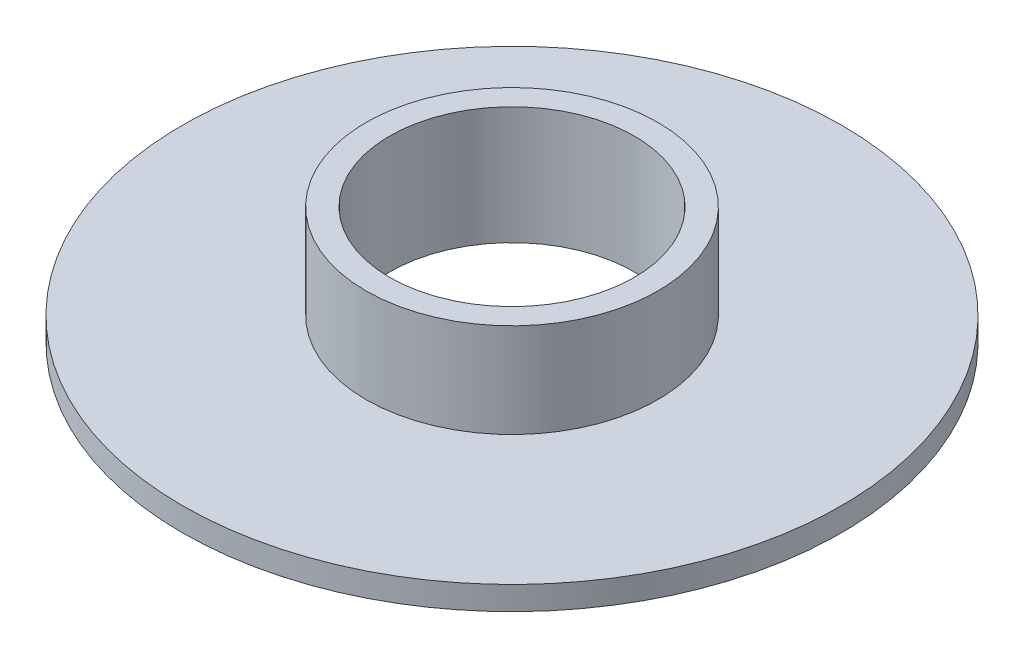
ISO-10303-21;
HEADER;
FILE_DESCRIPTION(('STEP AP214'),'2;1');
FILE_NAME('part.step','',(''),(''),'','','');
FILE_SCHEMA(('AUTOMOTIVE_DESIGN { 1 0 10303 214 1 1 1 1 }'));
ENDSEC;
DATA;
#1=APPLICATION_CONTEXT('core data for automotive mechanical design processes');
#2=APPLICATION_PROTOCOL_DEFINITION('international standard','automotive_design',2000,#1);
#3=PRODUCT_CONTEXT('',#1,'mechanical');
#4=PRODUCT('Part','Part','',(#3));
#5=PRODUCT_RELATED_PRODUCT_CATEGORY('part','',(#4));
#6=PRODUCT_DEFINITION_FORMATION('','',#4);
#7=PRODUCT_DEFINITION_CONTEXT('part definition',#1,'design');
#8=PRODUCT_DEFINITION('design','',#6,#7);
#9=PRODUCT_DEFINITION_SHAPE('','',#8);
#10=(LENGTH_UNIT() NAMED_UNIT(*) SI_UNIT(.MILLI.,.METRE.));
#11=(NAMED_UNIT(*) PLANE_ANGLE_UNIT() SI_UNIT($,.RADIAN.));
#12=(NAMED_UNIT(*) SI_UNIT($,.STERADIAN.) SOLID_ANGLE_UNIT());
#13=UNCERTAINTY_MEASURE_WITH_UNIT(LENGTH_MEASURE(1.E-05),#10,'distance_accuracy_value','');
#14=(GEOMETRIC_REPRESENTATION_CONTEXT(3) GLOBAL_UNCERTAINTY_ASSIGNED_CONTEXT((#13)) GLOBAL_UNIT_ASSIGNED_CONTEXT((#10,
#11,#12)) REPRESENTATION_CONTEXT('',''));
#15=CARTESIAN_POINT('',(0.,0.,0.));
#16=DIRECTION('',(0.,0.,1.));
#17=DIRECTION('',(1.,0.,0.));
#18=AXIS2_PLACEMENT_3D('',#15,#16,#17);
#19=CARTESIAN_POINT('',(0.,0.,0.));
#20=DIRECTION('',(0.,1.,0.));
#21=DIRECTION('',(0.,0.,1.));
#22=AXIS2_PLACEMENT_3D('',#19,#20,#21);
#23=PLANE('',#22);
#24=CARTESIAN_POINT('',(0.,0.,0.));
#25=DIRECTION('',(0.,1.,0.));
#26=DIRECTION('',(0.,0.,1.));
#27=AXIS2_PLACEMENT_3D('',#24,#25,#26);
#28=CIRCLE('',#27,26.);
#29=CARTESIAN_POINT('',(0.,0.,26.));
#30=VERTEX_POINT('',#29);
#31=EDGE_CURVE('E34',#30,#30,#28,.T.);
#32=ORIENTED_EDGE('',*,*,#31,.T.);
#33=EDGE_LOOP('',(#32));
#34=FACE_BOUND('',#33,.T.);
#35=CARTESIAN_POINT('',(0.,0.,0.));
#36=DIRECTION('',(0.,1.,0.));
#37=DIRECTION('',(0.,0.,1.));
#38=AXIS2_PLACEMENT_3D('',#35,#36,#37);
#39=CIRCLE('',#38,70.);
#40=CARTESIAN_POINT('',(0.,0.,70.));
#41=VERTEX_POINT('',#40);
#42=EDGE_CURVE('E10',#41,#41,#39,.T.);
#43=ORIENTED_EDGE('',*,*,#42,.F.);
#44=EDGE_LOOP('',(#43));
#45=FACE_BOUND('',#44,.T.);
#46=ADVANCED_FACE('F31',(#34,#45),#23,.F.);
#47=CARTESIAN_POINT('',(0.,4.99999999999999,0.));
#48=DIRECTION('',(0.,1.,0.));
#49=DIRECTION('',(0.,0.,1.));
#50=AXIS2_PLACEMENT_3D('',#47,#48,#49);
#51=CYLINDRICAL_SURFACE('',#50,70.);
#52=CARTESIAN_POINT('',(0.,5.,0.));
#53=DIRECTION('',(0.,1.,0.));
#54=DIRECTION('',(0.,0.,1.));
#55=AXIS2_PLACEMENT_3D('',#52,#53,#54);
#56=CIRCLE('',#55,70.);
#57=CARTESIAN_POINT('',(0.,5.,70.));
#58=VERTEX_POINT('',#57);
#59=EDGE_CURVE('E38',#58,#58,#56,.T.);
#60=ORIENTED_EDGE('',*,*,#59,.F.);
#61=EDGE_LOOP('',(#60));
#62=FACE_BOUND('',#61,.T.);
#63=ORIENTED_EDGE('',*,*,#42,.T.);
#64=EDGE_LOOP('',(#63));
#65=FACE_BOUND('',#64,.T.);
#66=ADVANCED_FACE('F70',(#62,#65),#51,.T.);
#67=CARTESIAN_POINT('',(0.,5.,-70.));
#68=DIRECTION('',(0.,-1.,0.));
#69=DIRECTION('',(0.,0.,-1.));
#70=AXIS2_PLACEMENT_3D('',#67,#68,#69);
#71=PLANE('',#70);
#72=CARTESIAN_POINT('',(0.,4.99999999999999,0.));
#73=DIRECTION('',(0.,1.,0.));
#74=DIRECTION('',(0.,0.,1.));
#75=AXIS2_PLACEMENT_3D('',#72,#73,#74);
#76=CIRCLE('',#75,31.);
#77=CARTESIAN_POINT('',(0.,4.99999999999999,31.));
#78=VERTEX_POINT('',#77);
#79=EDGE_CURVE('E42',#78,#78,#76,.T.);
#80=ORIENTED_EDGE('',*,*,#79,.F.);
#81=EDGE_LOOP('',(#80));
#82=FACE_BOUND('',#81,.T.);
#83=ORIENTED_EDGE('',*,*,#59,.T.);
#84=EDGE_LOOP('',(#83));
#85=FACE_BOUND('',#84,.T.);
#86=ADVANCED_FACE('F74',(#82,#85),#71,.F.);
#87=CARTESIAN_POINT('',(0.,4.99999999999999,0.));
#88=DIRECTION('',(0.,1.,0.));
#89=DIRECTION('',(0.,0.,1.));
#90=AXIS2_PLACEMENT_3D('',#87,#88,#89);
#91=CYLINDRICAL_SURFACE('',#90,31.);
#92=CARTESIAN_POINT('',(0.,25.,0.));
#93=DIRECTION('',(0.,1.,0.));
#94=DIRECTION('',(0.,0.,1.));
#95=AXIS2_PLACEMENT_3D('',#92,#93,#94);
#96=CIRCLE('',#95,31.);
#97=CARTESIAN_POINT('',(0.,25.,31.));
#98=VERTEX_POINT('',#97);
#99=EDGE_CURVE('E47',#98,#98,#96,.T.);
#100=ORIENTED_EDGE('',*,*,#99,.F.);
#101=EDGE_LOOP('',(#100));
#102=FACE_BOUND('',#101,.T.);
#103=ORIENTED_EDGE('',*,*,#79,.T.);
#104=EDGE_LOOP('',(#103));
#105=FACE_BOUND('',#104,.T.);
#106=ADVANCED_FACE('F66',(#102,#105),#91,.T.);
#107=CARTESIAN_POINT('',(0.,25.,-31.));
#108=DIRECTION('',(0.,-1.,0.));
#109=DIRECTION('',(0.,0.,-1.));
#110=AXIS2_PLACEMENT_3D('',#107,#108,#109);
#111=PLANE('',#110);
#112=CARTESIAN_POINT('',(0.,25.,0.));
#113=DIRECTION('',(0.,1.,0.));
#114=DIRECTION('',(0.,0.,1.));
#115=AXIS2_PLACEMENT_3D('',#112,#113,#114);
#116=CIRCLE('',#115,26.);
#117=CARTESIAN_POINT('',(0.,25.,26.));
#118=VERTEX_POINT('',#117);
#119=EDGE_CURVE('E50',#118,#118,#116,.T.);
#120=ORIENTED_EDGE('',*,*,#119,.F.);
#121=EDGE_LOOP('',(#120));
#122=FACE_BOUND('',#121,.T.);
#123=ORIENTED_EDGE('',*,*,#99,.T.);
#124=EDGE_LOOP('',(#123));
#125=FACE_BOUND('',#124,.T.);
#126=ADVANCED_FACE('F61',(#122,#125),#111,.F.);
#127=CARTESIAN_POINT('',(0.,4.99999999999999,0.));
#128=DIRECTION('',(0.,1.,0.));
#129=DIRECTION('',(0.,0.,1.));
#130=AXIS2_PLACEMENT_3D('',#127,#128,#129);
#131=CYLINDRICAL_SURFACE('',#130,26.);
#132=ORIENTED_EDGE('',*,*,#119,.T.);
#133=EDGE_LOOP('',(#132));
#134=FACE_BOUND('',#133,.T.);
#135=ORIENTED_EDGE('',*,*,#31,.F.);
#136=EDGE_LOOP('',(#135));
#137=FACE_BOUND('',#136,.T.);
#138=ADVANCED_FACE('F59',(#134,#137),#131,.F.);
#139=CLOSED_SHELL('',(#46,#66,#86,#106,#126,#138));
#140=MANIFOLD_SOLID_BREP('B2',#139);
#141=ADVANCED_BREP_SHAPE_REPRESENTATION('',(#18,#140),#14);
#142=SHAPE_DEFINITION_REPRESENTATION(#9,#141);
ENDSEC;
END-ISO-10303-21;
